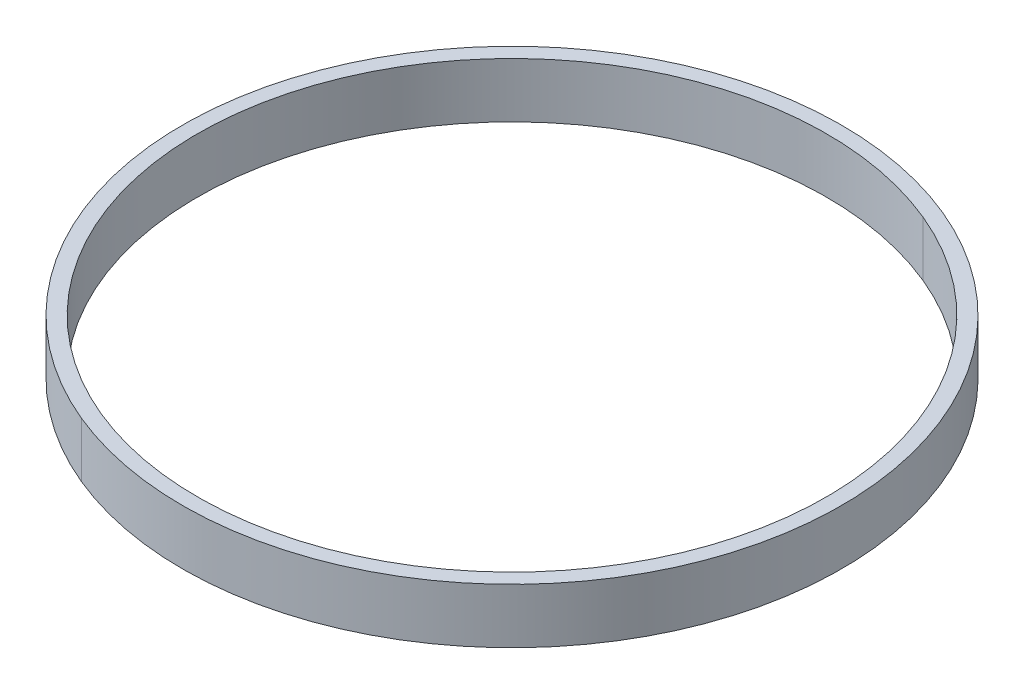
ISO-10303-21;
HEADER;
FILE_DESCRIPTION(('STEP AP214'),'2;1');
FILE_NAME('part.step','',(''),(''),'','','');
FILE_SCHEMA(('AUTOMOTIVE_DESIGN { 1 0 10303 214 1 1 1 1 }'));
ENDSEC;
DATA;
#1=APPLICATION_CONTEXT('core data for automotive mechanical design processes');
#2=APPLICATION_PROTOCOL_DEFINITION('international standard','automotive_design',2000,#1);
#3=PRODUCT_CONTEXT('',#1,'mechanical');
#4=PRODUCT('Part','Part','',(#3));
#5=PRODUCT_RELATED_PRODUCT_CATEGORY('part','',(#4));
#6=PRODUCT_DEFINITION_FORMATION('','',#4);
#7=PRODUCT_DEFINITION_CONTEXT('part definition',#1,'design');
#8=PRODUCT_DEFINITION('design','',#6,#7);
#9=PRODUCT_DEFINITION_SHAPE('','',#8);
#10=(LENGTH_UNIT() NAMED_UNIT(*) SI_UNIT(.MILLI.,.METRE.));
#11=(NAMED_UNIT(*) PLANE_ANGLE_UNIT() SI_UNIT($,.RADIAN.));
#12=(NAMED_UNIT(*) SI_UNIT($,.STERADIAN.) SOLID_ANGLE_UNIT());
#13=UNCERTAINTY_MEASURE_WITH_UNIT(LENGTH_MEASURE(1.E-05),#10,'distance_accuracy_value','');
#14=(GEOMETRIC_REPRESENTATION_CONTEXT(3) GLOBAL_UNCERTAINTY_ASSIGNED_CONTEXT((#13)) GLOBAL_UNIT_ASSIGNED_CONTEXT((#10,
#11,#12)) REPRESENTATION_CONTEXT('',''));
#15=CARTESIAN_POINT('',(0.,0.,0.));
#16=DIRECTION('',(0.,0.,1.));
#17=DIRECTION('',(1.,0.,0.));
#18=AXIS2_PLACEMENT_3D('',#15,#16,#17);
#19=CARTESIAN_POINT('',(4.63308018210544E-12,-156.000000054197,-787.5));
#20=DIRECTION('',(0.,-1.,0.));
#21=DIRECTION('',(0.383049008063229,0.,-0.923728021347072));
#22=AXIS2_PLACEMENT_3D('',#19,#20,#21);
#23=CYLINDRICAL_SURFACE('',#22,31.5);
#24=CARTESIAN_POINT('',(4.63308018210544E-12,-156.000000054197,-787.5));
#25=DIRECTION('',(0.,1.,0.));
#26=DIRECTION('',(-0.383049008063229,0.,0.923728021347072));
#27=AXIS2_PLACEMENT_3D('',#24,#25,#26);
#28=CIRCLE('',#27,31.5);
#29=CARTESIAN_POINT('',(12.0660437539963,-156.000000054197,-816.597432672429));
#30=VERTEX_POINT('',#29);
#31=CARTESIAN_POINT('',(-12.0660437539872,-156.000000054197,-758.402567327564));
#32=VERTEX_POINT('',#31);
#33=EDGE_CURVE('E11',#30,#32,#28,.T.);
#34=ORIENTED_EDGE('',*,*,#33,.T.);
#35=DIRECTION('',(0.,-1.,0.));
#36=VECTOR('',#35,1.);
#37=CARTESIAN_POINT('',(-12.0660437539871,-156.000000054197,-758.402567327563));
#38=LINE('',#37,#36);
#39=CARTESIAN_POINT('',(-12.0660437539869,-161.500000054197,-758.402567327564));
#40=VERTEX_POINT('',#39);
#41=EDGE_CURVE('E27',#32,#40,#38,.T.);
#42=ORIENTED_EDGE('',*,*,#41,.T.);
#43=CARTESIAN_POINT('',(4.61823637944041E-12,-161.500000054197,-787.5));
#44=DIRECTION('',(0.,1.,0.));
#45=DIRECTION('',(-0.383049008063229,0.,0.923728021347072));
#46=AXIS2_PLACEMENT_3D('',#43,#44,#45);
#47=CIRCLE('',#46,31.5);
#48=CARTESIAN_POINT('',(12.0660437539965,-161.500000054197,-816.59743267243));
#49=VERTEX_POINT('',#48);
#50=EDGE_CURVE('E110',#49,#40,#47,.T.);
#51=ORIENTED_EDGE('',*,*,#50,.F.);
#52=DIRECTION('',(0.,-1.,0.));
#53=VECTOR('',#52,1.);
#54=CARTESIAN_POINT('',(12.0660437539964,-156.000000054197,-816.597432672429));
#55=LINE('',#54,#53);
#56=EDGE_CURVE('E57',#30,#49,#55,.T.);
#57=ORIENTED_EDGE('',*,*,#56,.F.);
#58=EDGE_LOOP('',(#34,#42,#51,#57));
#59=FACE_BOUND('',#58,.T.);
#60=ADVANCED_FACE('F16',(#59),#23,.F.);
#61=CARTESIAN_POINT('',(4.63308018210544E-12,-156.000000054197,-787.5));
#62=DIRECTION('',(0.,-1.,0.));
#63=DIRECTION('',(0.38304900806323,0.,-0.923728021347072));
#64=AXIS2_PLACEMENT_3D('',#61,#62,#63);
#65=CYLINDRICAL_SURFACE('',#64,33.);
#66=CARTESIAN_POINT('',(4.63308018210544E-12,-156.000000054197,-787.5));
#67=DIRECTION('',(0.,1.,0.));
#68=DIRECTION('',(-0.38304900806323,0.,0.923728021347072));
#69=AXIS2_PLACEMENT_3D('',#66,#67,#68);
#70=CIRCLE('',#69,33.);
#71=CARTESIAN_POINT('',(-12.640617266082,-156.000000054197,-757.016975295543));
#72=VERTEX_POINT('',#71);
#73=CARTESIAN_POINT('',(12.6406172660911,-156.000000054197,-817.98302470445));
#74=VERTEX_POINT('',#73);
#75=EDGE_CURVE('E70',#72,#74,#70,.T.);
#76=ORIENTED_EDGE('',*,*,#75,.F.);
#77=DIRECTION('',(0.,-1.,0.));
#78=VECTOR('',#77,1.);
#79=CARTESIAN_POINT('',(-12.640617266082,-156.000000054197,-757.016975295543));
#80=LINE('',#79,#78);
#81=CARTESIAN_POINT('',(-12.6406172660818,-161.500000054197,-757.016975295544));
#82=VERTEX_POINT('',#81);
#83=EDGE_CURVE('E20',#72,#82,#80,.T.);
#84=ORIENTED_EDGE('',*,*,#83,.T.);
#85=CARTESIAN_POINT('',(4.61823637944041E-12,-161.500000054197,-787.5));
#86=DIRECTION('',(0.,1.,0.));
#87=DIRECTION('',(-0.38304900806323,0.,0.923728021347072));
#88=AXIS2_PLACEMENT_3D('',#85,#86,#87);
#89=CIRCLE('',#88,33.);
#90=CARTESIAN_POINT('',(12.6406172660914,-161.500000054197,-817.98302470445));
#91=VERTEX_POINT('',#90);
#92=EDGE_CURVE('E94',#82,#91,#89,.T.);
#93=ORIENTED_EDGE('',*,*,#92,.T.);
#94=DIRECTION('',(0.,-1.,0.));
#95=VECTOR('',#94,1.);
#96=CARTESIAN_POINT('',(12.6406172660912,-156.000000054197,-817.98302470445));
#97=LINE('',#96,#95);
#98=EDGE_CURVE('E81',#74,#91,#97,.T.);
#99=ORIENTED_EDGE('',*,*,#98,.F.);
#100=EDGE_LOOP('',(#76,#84,#93,#99));
#101=FACE_BOUND('',#100,.T.);
#102=ADVANCED_FACE('F95',(#101),#65,.T.);
#103=CARTESIAN_POINT('',(4.63308018210544E-12,-156.000000054197,-787.5));
#104=DIRECTION('',(0.,1.,0.));
#105=DIRECTION('',(1.,0.,0.));
#106=AXIS2_PLACEMENT_3D('',#103,#104,#105);
#107=PLANE('',#106);
#108=CARTESIAN_POINT('',(4.63308018210544E-12,-156.000000054197,-787.5));
#109=DIRECTION('',(0.,1.,0.));
#110=DIRECTION('',(-0.38304900806323,0.,0.923728021347072));
#111=AXIS2_PLACEMENT_3D('',#108,#109,#110);
#112=CIRCLE('',#111,33.);
#113=EDGE_CURVE('E91',#74,#72,#112,.T.);
#114=ORIENTED_EDGE('',*,*,#113,.T.);
#115=ORIENTED_EDGE('',*,*,#75,.T.);
#116=EDGE_LOOP('',(#114,#115));
#117=FACE_BOUND('',#116,.T.);
#118=ORIENTED_EDGE('',*,*,#33,.F.);
#119=CARTESIAN_POINT('',(4.63308018210544E-12,-156.000000054197,-787.5));
#120=DIRECTION('',(0.,1.,0.));
#121=DIRECTION('',(-0.383049008063229,0.,0.923728021347072));
#122=AXIS2_PLACEMENT_3D('',#119,#120,#121);
#123=CIRCLE('',#122,31.5);
#124=EDGE_CURVE('E101',#32,#30,#123,.T.);
#125=ORIENTED_EDGE('',*,*,#124,.F.);
#126=EDGE_LOOP('',(#118,#125));
#127=FACE_BOUND('',#126,.T.);
#128=ADVANCED_FACE('F127',(#117,#127),#107,.T.);
#129=CARTESIAN_POINT('',(4.61823637944041E-12,-161.500000054197,-787.5));
#130=DIRECTION('',(0.,1.,0.));
#131=DIRECTION('',(1.,0.,0.));
#132=AXIS2_PLACEMENT_3D('',#129,#130,#131);
#133=PLANE('',#132);
#134=CARTESIAN_POINT('',(4.61823637944041E-12,-161.500000054197,-787.5));
#135=DIRECTION('',(0.,1.,0.));
#136=DIRECTION('',(-0.38304900806323,0.,0.923728021347072));
#137=AXIS2_PLACEMENT_3D('',#134,#135,#136);
#138=CIRCLE('',#137,33.);
#139=EDGE_CURVE('E89',#91,#82,#138,.T.);
#140=ORIENTED_EDGE('',*,*,#139,.F.);
#141=ORIENTED_EDGE('',*,*,#92,.F.);
#142=EDGE_LOOP('',(#140,#141));
#143=FACE_BOUND('',#142,.T.);
#144=ORIENTED_EDGE('',*,*,#50,.T.);
#145=CARTESIAN_POINT('',(4.61823637944041E-12,-161.500000054197,-787.5));
#146=DIRECTION('',(0.,1.,0.));
#147=DIRECTION('',(-0.383049008063229,0.,0.923728021347072));
#148=AXIS2_PLACEMENT_3D('',#145,#146,#147);
#149=CIRCLE('',#148,31.5);
#150=EDGE_CURVE('E93',#40,#49,#149,.T.);
#151=ORIENTED_EDGE('',*,*,#150,.T.);
#152=EDGE_LOOP('',(#144,#151));
#153=FACE_BOUND('',#152,.T.);
#154=ADVANCED_FACE('F18',(#143,#153),#133,.F.);
#155=CARTESIAN_POINT('',(4.63308018210544E-12,-156.000000054197,-787.5));
#156=DIRECTION('',(0.,-1.,0.));
#157=DIRECTION('',(0.38304900806323,0.,-0.923728021347072));
#158=AXIS2_PLACEMENT_3D('',#155,#156,#157);
#159=CYLINDRICAL_SURFACE('',#158,33.);
#160=ORIENTED_EDGE('',*,*,#83,.F.);
#161=ORIENTED_EDGE('',*,*,#113,.F.);
#162=ORIENTED_EDGE('',*,*,#98,.T.);
#163=ORIENTED_EDGE('',*,*,#139,.T.);
#164=EDGE_LOOP('',(#160,#161,#162,#163));
#165=FACE_BOUND('',#164,.T.);
#166=ADVANCED_FACE('F87',(#165),#159,.T.);
#167=CARTESIAN_POINT('',(4.63308018210544E-12,-156.000000054197,-787.5));
#168=DIRECTION('',(0.,-1.,0.));
#169=DIRECTION('',(0.383049008063229,0.,-0.923728021347072));
#170=AXIS2_PLACEMENT_3D('',#167,#168,#169);
#171=CYLINDRICAL_SURFACE('',#170,31.5);
#172=ORIENTED_EDGE('',*,*,#41,.F.);
#173=ORIENTED_EDGE('',*,*,#124,.T.);
#174=ORIENTED_EDGE('',*,*,#56,.T.);
#175=ORIENTED_EDGE('',*,*,#150,.F.);
#176=EDGE_LOOP('',(#172,#173,#174,#175));
#177=FACE_BOUND('',#176,.T.);
#178=ADVANCED_FACE('F125',(#177),#171,.F.);
#179=CLOSED_SHELL('',(#60,#102,#128,#154,#166,#178));
#180=MANIFOLD_SOLID_BREP('B1',#179);
#181=ADVANCED_BREP_SHAPE_REPRESENTATION('',(#18,#180),#14);
#182=SHAPE_DEFINITION_REPRESENTATION(#9,#181);
ENDSEC;
END-ISO-10303-21;
